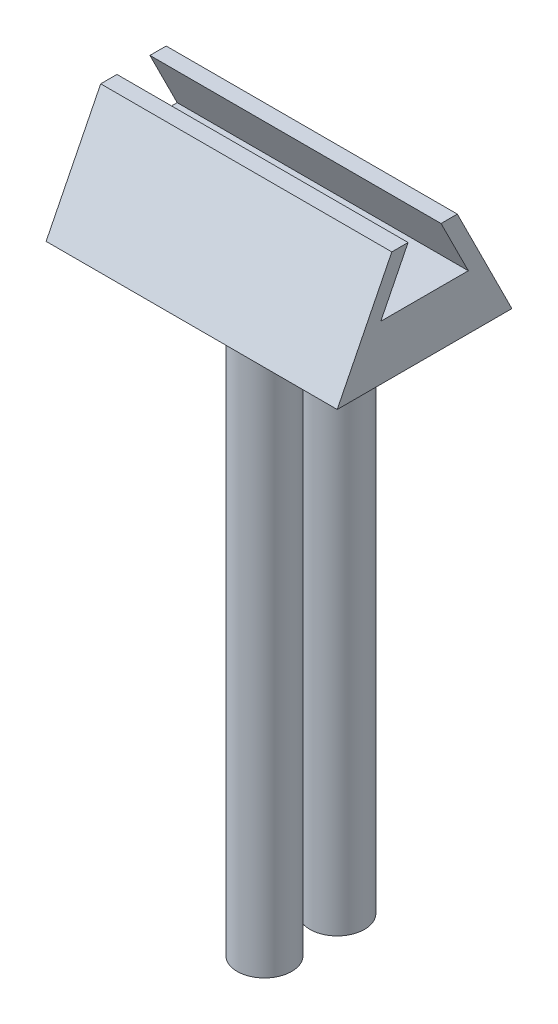
ISO-10303-21;
HEADER;
FILE_DESCRIPTION(('STEP AP214'),'2;1');
FILE_NAME('part.step','',(''),(''),'','','');
FILE_SCHEMA(('AUTOMOTIVE_DESIGN { 1 0 10303 214 1 1 1 1 }'));
ENDSEC;
DATA;
#1=APPLICATION_CONTEXT('core data for automotive mechanical design processes');
#2=APPLICATION_PROTOCOL_DEFINITION('international standard','automotive_design',2000,#1);
#3=PRODUCT_CONTEXT('',#1,'mechanical');
#4=PRODUCT('Part','Part','',(#3));
#5=PRODUCT_RELATED_PRODUCT_CATEGORY('part','',(#4));
#6=PRODUCT_DEFINITION_FORMATION('','',#4);
#7=PRODUCT_DEFINITION_CONTEXT('part definition',#1,'design');
#8=PRODUCT_DEFINITION('design','',#6,#7);
#9=PRODUCT_DEFINITION_SHAPE('','',#8);
#10=(LENGTH_UNIT() NAMED_UNIT(*) SI_UNIT(.MILLI.,.METRE.));
#11=(NAMED_UNIT(*) PLANE_ANGLE_UNIT() SI_UNIT($,.RADIAN.));
#12=(NAMED_UNIT(*) SI_UNIT($,.STERADIAN.) SOLID_ANGLE_UNIT());
#13=UNCERTAINTY_MEASURE_WITH_UNIT(LENGTH_MEASURE(1.E-05),#10,'distance_accuracy_value','');
#14=(GEOMETRIC_REPRESENTATION_CONTEXT(3) GLOBAL_UNCERTAINTY_ASSIGNED_CONTEXT((#13)) GLOBAL_UNIT_ASSIGNED_CONTEXT((#10,
#11,#12)) REPRESENTATION_CONTEXT('',''));
#15=CARTESIAN_POINT('',(0.,0.,0.));
#16=DIRECTION('',(0.,0.,1.));
#17=DIRECTION('',(1.,0.,0.));
#18=AXIS2_PLACEMENT_3D('',#15,#16,#17);
#19=CARTESIAN_POINT('',(0.,30.,0.));
#20=DIRECTION('',(0.,1.,0.));
#21=DIRECTION('',(0.,0.,1.));
#22=AXIS2_PLACEMENT_3D('',#19,#20,#21);
#23=PLANE('',#22);
#24=DIRECTION('',(1.,0.,0.));
#25=VECTOR('',#24,1.);
#26=CARTESIAN_POINT('',(-80.,30.,-28.5278640450004));
#27=LINE('',#26,#25);
#28=CARTESIAN_POINT('',(-80.,30.,-28.5278640450004));
#29=VERTEX_POINT('',#28);
#30=CARTESIAN_POINT('',(0.,30.,-28.5278640450004));
#31=VERTEX_POINT('',#30);
#32=EDGE_CURVE('E157',#29,#31,#27,.T.);
#33=ORIENTED_EDGE('',*,*,#32,.T.);
#34=DIRECTION('',(0.,0.,-1.));
#35=VECTOR('',#34,1.);
#36=CARTESIAN_POINT('',(0.,30.,0.));
#37=LINE('',#36,#35);
#38=CARTESIAN_POINT('',(0.,30.,-33.));
#39=VERTEX_POINT('',#38);
#40=EDGE_CURVE('E190',#31,#39,#37,.T.);
#41=ORIENTED_EDGE('',*,*,#40,.T.);
#42=DIRECTION('',(1.,0.,0.));
#43=VECTOR('',#42,1.);
#44=CARTESIAN_POINT('',(-80.,30.,-33.));
#45=LINE('',#44,#43);
#46=CARTESIAN_POINT('',(-80.,30.,-33.));
#47=VERTEX_POINT('',#46);
#48=EDGE_CURVE('E161',#47,#39,#45,.T.);
#49=ORIENTED_EDGE('',*,*,#48,.F.);
#50=DIRECTION('',(0.,0.,1.));
#51=VECTOR('',#50,1.);
#52=CARTESIAN_POINT('',(-80.,30.,0.));
#53=LINE('',#52,#51);
#54=EDGE_CURVE('E191',#47,#29,#53,.T.);
#55=ORIENTED_EDGE('',*,*,#54,.T.);
#56=EDGE_LOOP('',(#33,#41,#49,#55));
#57=FACE_BOUND('',#56,.T.);
#58=ADVANCED_FACE('F51',(#57),#23,.T.);
#59=CARTESIAN_POINT('',(0.,30.,0.));
#60=DIRECTION('',(-1.,0.,0.));
#61=DIRECTION('',(0.,0.,1.));
#62=AXIS2_PLACEMENT_3D('',#59,#60,#61);
#63=PLANE('',#62);
#64=ORIENTED_EDGE('',*,*,#40,.F.);
#65=DIRECTION('',(0.,0.894427190999916,0.447213595499959));
#66=VECTOR('',#65,1.);
#67=CARTESIAN_POINT('',(0.,15.,-36.0278640450004));
#68=LINE('',#67,#66);
#69=CARTESIAN_POINT('',(0.,15.,-36.0278640450004));
#70=VERTEX_POINT('',#69);
#71=EDGE_CURVE('E142',#70,#31,#68,.T.);
#72=ORIENTED_EDGE('',*,*,#71,.F.);
#73=DIRECTION('',(0.,0.,-1.));
#74=VECTOR('',#73,1.);
#75=CARTESIAN_POINT('',(0.,15.,-11.9721359549996));
#76=LINE('',#75,#74);
#77=CARTESIAN_POINT('',(0.,15.,-11.9721359549996));
#78=VERTEX_POINT('',#77);
#79=EDGE_CURVE('E145',#78,#70,#76,.T.);
#80=ORIENTED_EDGE('',*,*,#79,.F.);
#81=DIRECTION('',(0.,-0.894427190999916,0.447213595499958));
#82=VECTOR('',#81,1.);
#83=CARTESIAN_POINT('',(0.,30.,-19.4721359549996));
#84=LINE('',#83,#82);
#85=CARTESIAN_POINT('',(0.,30.,-19.4721359549996));
#86=VERTEX_POINT('',#85);
#87=EDGE_CURVE('E121',#86,#78,#84,.T.);
#88=ORIENTED_EDGE('',*,*,#87,.F.);
#89=CARTESIAN_POINT('',(0.,30.,-15.));
#90=VERTEX_POINT('',#89);
#91=EDGE_CURVE('E186',#90,#86,#37,.T.);
#92=ORIENTED_EDGE('',*,*,#91,.F.);
#93=DIRECTION('',(0.,0.894427190999916,-0.447213595499958));
#94=VECTOR('',#93,1.);
#95=CARTESIAN_POINT('',(0.,0.,0.));
#96=LINE('',#95,#94);
#97=CARTESIAN_POINT('',(0.,0.,0.));
#98=VERTEX_POINT('',#97);
#99=EDGE_CURVE('E169',#98,#90,#96,.T.);
#100=ORIENTED_EDGE('',*,*,#99,.F.);
#101=DIRECTION('',(0.,0.,-1.));
#102=VECTOR('',#101,1.);
#103=CARTESIAN_POINT('',(0.,0.,0.));
#104=LINE('',#103,#102);
#105=CARTESIAN_POINT('',(0.,0.,-48.));
#106=VERTEX_POINT('',#105);
#107=EDGE_CURVE('E176',#98,#106,#104,.T.);
#108=ORIENTED_EDGE('',*,*,#107,.T.);
#109=DIRECTION('',(0.,-0.894427190999916,-0.447213595499958));
#110=VECTOR('',#109,1.);
#111=CARTESIAN_POINT('',(0.,0.,-48.));
#112=LINE('',#111,#110);
#113=EDGE_CURVE('E172',#39,#106,#112,.T.);
#114=ORIENTED_EDGE('',*,*,#113,.F.);
#115=EDGE_LOOP('',(#64,#72,#80,#88,#92,#100,#108,#114));
#116=FACE_BOUND('',#115,.T.);
#117=ADVANCED_FACE('F53',(#116),#63,.F.);
#118=CARTESIAN_POINT('',(-80.,30.,0.));
#119=DIRECTION('',(1.,0.,0.));
#120=DIRECTION('',(0.,0.,-1.));
#121=AXIS2_PLACEMENT_3D('',#118,#119,#120);
#122=PLANE('',#121);
#123=DIRECTION('',(0.,0.,-1.));
#124=VECTOR('',#123,1.);
#125=CARTESIAN_POINT('',(-80.,15.,-11.9721359549996));
#126=LINE('',#125,#124);
#127=CARTESIAN_POINT('',(-80.,15.,-11.9721359549996));
#128=VERTEX_POINT('',#127);
#129=CARTESIAN_POINT('',(-80.,15.,-36.0278640450004));
#130=VERTEX_POINT('',#129);
#131=EDGE_CURVE('E130',#128,#130,#126,.T.);
#132=ORIENTED_EDGE('',*,*,#131,.T.);
#133=DIRECTION('',(0.,0.894427190999916,0.447213595499959));
#134=VECTOR('',#133,1.);
#135=CARTESIAN_POINT('',(-80.,15.,-36.0278640450004));
#136=LINE('',#135,#134);
#137=EDGE_CURVE('E136',#130,#29,#136,.T.);
#138=ORIENTED_EDGE('',*,*,#137,.T.);
#139=ORIENTED_EDGE('',*,*,#54,.F.);
#140=DIRECTION('',(0.,-0.894427190999916,-0.447213595499958));
#141=VECTOR('',#140,1.);
#142=CARTESIAN_POINT('',(-80.,0.,-48.));
#143=LINE('',#142,#141);
#144=CARTESIAN_POINT('',(-80.,0.,-48.));
#145=VERTEX_POINT('',#144);
#146=EDGE_CURVE('E180',#47,#145,#143,.T.);
#147=ORIENTED_EDGE('',*,*,#146,.T.);
#148=DIRECTION('',(0.,0.,1.));
#149=VECTOR('',#148,1.);
#150=CARTESIAN_POINT('',(-80.,0.,0.));
#151=LINE('',#150,#149);
#152=CARTESIAN_POINT('',(-80.,0.,0.));
#153=VERTEX_POINT('',#152);
#154=EDGE_CURVE('E201',#145,#153,#151,.T.);
#155=ORIENTED_EDGE('',*,*,#154,.T.);
#156=DIRECTION('',(0.,0.894427190999916,-0.447213595499958));
#157=VECTOR('',#156,1.);
#158=CARTESIAN_POINT('',(-80.,0.,0.));
#159=LINE('',#158,#157);
#160=CARTESIAN_POINT('',(-80.,30.,-15.));
#161=VERTEX_POINT('',#160);
#162=EDGE_CURVE('E76',#153,#161,#159,.T.);
#163=ORIENTED_EDGE('',*,*,#162,.T.);
#164=CARTESIAN_POINT('',(-80.,30.,-19.4721359549996));
#165=VERTEX_POINT('',#164);
#166=EDGE_CURVE('E140',#165,#161,#53,.T.);
#167=ORIENTED_EDGE('',*,*,#166,.F.);
#168=DIRECTION('',(0.,-0.894427190999916,0.447213595499958));
#169=VECTOR('',#168,1.);
#170=CARTESIAN_POINT('',(-80.,30.,-19.4721359549996));
#171=LINE('',#170,#169);
#172=EDGE_CURVE('E68',#165,#128,#171,.T.);
#173=ORIENTED_EDGE('',*,*,#172,.T.);
#174=EDGE_LOOP('',(#132,#138,#139,#147,#155,#163,#167,#173));
#175=FACE_BOUND('',#174,.T.);
#176=ADVANCED_FACE('F139',(#175),#122,.F.);
#177=DIRECTION('',(1.,0.,0.));
#178=VECTOR('',#177,1.);
#179=CARTESIAN_POINT('',(-80.,30.,-19.4721359549996));
#180=LINE('',#179,#178);
#181=EDGE_CURVE('E127',#165,#86,#180,.T.);
#182=ORIENTED_EDGE('',*,*,#181,.F.);
#183=ORIENTED_EDGE('',*,*,#166,.T.);
#184=DIRECTION('',(1.,0.,0.));
#185=VECTOR('',#184,1.);
#186=CARTESIAN_POINT('',(-80.,30.,-15.));
#187=LINE('',#186,#185);
#188=EDGE_CURVE('E168',#161,#90,#187,.T.);
#189=ORIENTED_EDGE('',*,*,#188,.T.);
#190=ORIENTED_EDGE('',*,*,#91,.T.);
#191=EDGE_LOOP('',(#182,#183,#189,#190));
#192=FACE_BOUND('',#191,.T.);
#193=ADVANCED_FACE('F226',(#192),#23,.T.);
#194=CARTESIAN_POINT('',(0.,0.,0.));
#195=DIRECTION('',(0.,1.,0.));
#196=DIRECTION('',(0.,0.,1.));
#197=AXIS2_PLACEMENT_3D('',#194,#195,#196);
#198=PLANE('',#197);
#199=CARTESIAN_POINT('',(-40.,0.,-20.));
#200=DIRECTION('',(0.,-1.,0.));
#201=DIRECTION('',(0.,0.,-1.));
#202=AXIS2_PLACEMENT_3D('',#199,#200,#201);
#203=CIRCLE('',#202,7.5);
#204=CARTESIAN_POINT('',(-40.,0.,-27.5));
#205=VERTEX_POINT('',#204);
#206=EDGE_CURVE('E11',#205,#205,#203,.T.);
#207=ORIENTED_EDGE('',*,*,#206,.F.);
#208=EDGE_LOOP('',(#207));
#209=FACE_BOUND('',#208,.T.);
#210=CARTESIAN_POINT('',(-40.,0.,-40.));
#211=DIRECTION('',(0.,1.,0.));
#212=DIRECTION('',(0.,0.,1.));
#213=AXIS2_PLACEMENT_3D('',#210,#211,#212);
#214=CIRCLE('',#213,7.5);
#215=CARTESIAN_POINT('',(-40.,0.,-32.5));
#216=VERTEX_POINT('',#215);
#217=EDGE_CURVE('E55',#216,#216,#214,.F.);
#218=ORIENTED_EDGE('',*,*,#217,.F.);
#219=EDGE_LOOP('',(#218));
#220=FACE_BOUND('',#219,.T.);
#221=ORIENTED_EDGE('',*,*,#107,.F.);
#222=DIRECTION('',(1.,0.,0.));
#223=VECTOR('',#222,1.);
#224=CARTESIAN_POINT('',(0.,0.,0.));
#225=LINE('',#224,#223);
#226=EDGE_CURVE('E203',#153,#98,#225,.T.);
#227=ORIENTED_EDGE('',*,*,#226,.F.);
#228=ORIENTED_EDGE('',*,*,#154,.F.);
#229=DIRECTION('',(-1.,0.,0.));
#230=VECTOR('',#229,1.);
#231=CARTESIAN_POINT('',(0.,0.,-48.));
#232=LINE('',#231,#230);
#233=EDGE_CURVE('E198',#106,#145,#232,.T.);
#234=ORIENTED_EDGE('',*,*,#233,.F.);
#235=EDGE_LOOP('',(#221,#227,#228,#234));
#236=FACE_BOUND('',#235,.T.);
#237=ADVANCED_FACE('F221',(#209,#220,#236),#198,.F.);
#238=CARTESIAN_POINT('',(-80.,0.,-48.));
#239=DIRECTION('',(0.,-0.447213595499958,0.894427190999916));
#240=DIRECTION('',(0.,-0.894427190999916,-0.447213595499958));
#241=AXIS2_PLACEMENT_3D('',#238,#239,#240);
#242=PLANE('',#241);
#243=ORIENTED_EDGE('',*,*,#113,.T.);
#244=ORIENTED_EDGE('',*,*,#233,.T.);
#245=ORIENTED_EDGE('',*,*,#146,.F.);
#246=ORIENTED_EDGE('',*,*,#48,.T.);
#247=EDGE_LOOP('',(#243,#244,#245,#246));
#248=FACE_BOUND('',#247,.T.);
#249=ADVANCED_FACE('F216',(#248),#242,.F.);
#250=CARTESIAN_POINT('',(-80.,0.,0.));
#251=DIRECTION('',(0.,-0.447213595499958,-0.894427190999916));
#252=DIRECTION('',(0.,0.894427190999916,-0.447213595499958));
#253=AXIS2_PLACEMENT_3D('',#250,#251,#252);
#254=PLANE('',#253);
#255=ORIENTED_EDGE('',*,*,#99,.T.);
#256=ORIENTED_EDGE('',*,*,#188,.F.);
#257=ORIENTED_EDGE('',*,*,#162,.F.);
#258=ORIENTED_EDGE('',*,*,#226,.T.);
#259=EDGE_LOOP('',(#255,#256,#257,#258));
#260=FACE_BOUND('',#259,.T.);
#261=ADVANCED_FACE('F227',(#260),#254,.F.);
#262=CARTESIAN_POINT('',(-80.,15.,-36.0278640450004));
#263=DIRECTION('',(0.,0.447213595499959,-0.894427190999916));
#264=DIRECTION('',(0.,0.894427190999916,0.447213595499959));
#265=AXIS2_PLACEMENT_3D('',#262,#263,#264);
#266=PLANE('',#265);
#267=ORIENTED_EDGE('',*,*,#71,.T.);
#268=ORIENTED_EDGE('',*,*,#32,.F.);
#269=ORIENTED_EDGE('',*,*,#137,.F.);
#270=DIRECTION('',(1.,0.,0.));
#271=VECTOR('',#270,1.);
#272=CARTESIAN_POINT('',(-80.,15.,-36.0278640450004));
#273=LINE('',#272,#271);
#274=EDGE_CURVE('E126',#130,#70,#273,.T.);
#275=ORIENTED_EDGE('',*,*,#274,.T.);
#276=EDGE_LOOP('',(#267,#268,#269,#275));
#277=FACE_BOUND('',#276,.T.);
#278=ADVANCED_FACE('F224',(#277),#266,.F.);
#279=CARTESIAN_POINT('',(-80.,15.,-11.9721359549996));
#280=DIRECTION('',(0.,-1.,0.));
#281=DIRECTION('',(0.,0.,-1.));
#282=AXIS2_PLACEMENT_3D('',#279,#280,#281);
#283=PLANE('',#282);
#284=ORIENTED_EDGE('',*,*,#79,.T.);
#285=ORIENTED_EDGE('',*,*,#274,.F.);
#286=ORIENTED_EDGE('',*,*,#131,.F.);
#287=DIRECTION('',(1.,0.,0.));
#288=VECTOR('',#287,1.);
#289=CARTESIAN_POINT('',(-80.,15.,-11.9721359549996));
#290=LINE('',#289,#288);
#291=EDGE_CURVE('E117',#128,#78,#290,.T.);
#292=ORIENTED_EDGE('',*,*,#291,.T.);
#293=EDGE_LOOP('',(#284,#285,#286,#292));
#294=FACE_BOUND('',#293,.T.);
#295=ADVANCED_FACE('F131',(#294),#283,.F.);
#296=CARTESIAN_POINT('',(-80.,30.,-19.4721359549996));
#297=DIRECTION('',(0.,0.447213595499958,0.894427190999916));
#298=DIRECTION('',(0.,-0.894427190999916,0.447213595499958));
#299=AXIS2_PLACEMENT_3D('',#296,#297,#298);
#300=PLANE('',#299);
#301=ORIENTED_EDGE('',*,*,#87,.T.);
#302=ORIENTED_EDGE('',*,*,#291,.F.);
#303=ORIENTED_EDGE('',*,*,#172,.F.);
#304=ORIENTED_EDGE('',*,*,#181,.T.);
#305=EDGE_LOOP('',(#301,#302,#303,#304));
#306=FACE_BOUND('',#305,.T.);
#307=ADVANCED_FACE('F119',(#306),#300,.F.);
#308=CARTESIAN_POINT('',(-40.,-160.,-40.));
#309=DIRECTION('',(0.,1.,0.));
#310=DIRECTION('',(0.,0.,1.));
#311=AXIS2_PLACEMENT_3D('',#308,#309,#310);
#312=CYLINDRICAL_SURFACE('',#311,7.5);
#313=CARTESIAN_POINT('',(-40.,-160.,-40.));
#314=DIRECTION('',(0.,-1.,0.));
#315=DIRECTION('',(0.,0.,-1.));
#316=AXIS2_PLACEMENT_3D('',#313,#314,#315);
#317=CIRCLE('',#316,7.5);
#318=CARTESIAN_POINT('',(-40.,-160.,-47.5));
#319=VERTEX_POINT('',#318);
#320=EDGE_CURVE('E148',#319,#319,#317,.T.);
#321=ORIENTED_EDGE('',*,*,#320,.F.);
#322=EDGE_LOOP('',(#321));
#323=FACE_BOUND('',#322,.T.);
#324=ORIENTED_EDGE('',*,*,#217,.T.);
#325=EDGE_LOOP('',(#324));
#326=FACE_BOUND('',#325,.T.);
#327=ADVANCED_FACE('F300',(#323,#326),#312,.T.);
#328=CARTESIAN_POINT('',(-40.,-160.,-40.));
#329=DIRECTION('',(0.,-1.,0.));
#330=DIRECTION('',(0.,0.,-1.));
#331=AXIS2_PLACEMENT_3D('',#328,#329,#330);
#332=PLANE('',#331);
#333=ORIENTED_EDGE('',*,*,#320,.T.);
#334=EDGE_LOOP('',(#333));
#335=FACE_BOUND('',#334,.T.);
#336=ADVANCED_FACE('F307',(#335),#332,.T.);
#337=CARTESIAN_POINT('',(-40.,-160.,-20.));
#338=DIRECTION('',(0.,1.,0.));
#339=DIRECTION('',(0.,0.,1.));
#340=AXIS2_PLACEMENT_3D('',#337,#338,#339);
#341=CYLINDRICAL_SURFACE('',#340,7.5);
#342=CARTESIAN_POINT('',(-40.,-160.,-20.));
#343=DIRECTION('',(0.,-1.,0.));
#344=DIRECTION('',(0.,0.,-1.));
#345=AXIS2_PLACEMENT_3D('',#342,#343,#344);
#346=CIRCLE('',#345,7.5);
#347=CARTESIAN_POINT('',(-40.,-160.,-27.5));
#348=VERTEX_POINT('',#347);
#349=EDGE_CURVE('E154',#348,#348,#346,.T.);
#350=ORIENTED_EDGE('',*,*,#349,.F.);
#351=EDGE_LOOP('',(#350));
#352=FACE_BOUND('',#351,.T.);
#353=ORIENTED_EDGE('',*,*,#206,.T.);
#354=EDGE_LOOP('',(#353));
#355=FACE_BOUND('',#354,.T.);
#356=ADVANCED_FACE('F317',(#352,#355),#341,.T.);
#357=CARTESIAN_POINT('',(-40.,-160.,-20.));
#358=DIRECTION('',(0.,-1.,0.));
#359=DIRECTION('',(0.,0.,-1.));
#360=AXIS2_PLACEMENT_3D('',#357,#358,#359);
#361=PLANE('',#360);
#362=ORIENTED_EDGE('',*,*,#349,.T.);
#363=EDGE_LOOP('',(#362));
#364=FACE_BOUND('',#363,.T.);
#365=ADVANCED_FACE('F327',(#364),#361,.T.);
#366=CLOSED_SHELL('',(#58,#117,#176,#193,#237,#249,#261,#278,#295,#307,#327,#336,#356,#365));
#367=MANIFOLD_SOLID_BREP('B2',#366);
#368=ADVANCED_BREP_SHAPE_REPRESENTATION('',(#18,#367),#14);
#369=SHAPE_DEFINITION_REPRESENTATION(#9,#368);
ENDSEC;
END-ISO-10303-21;
